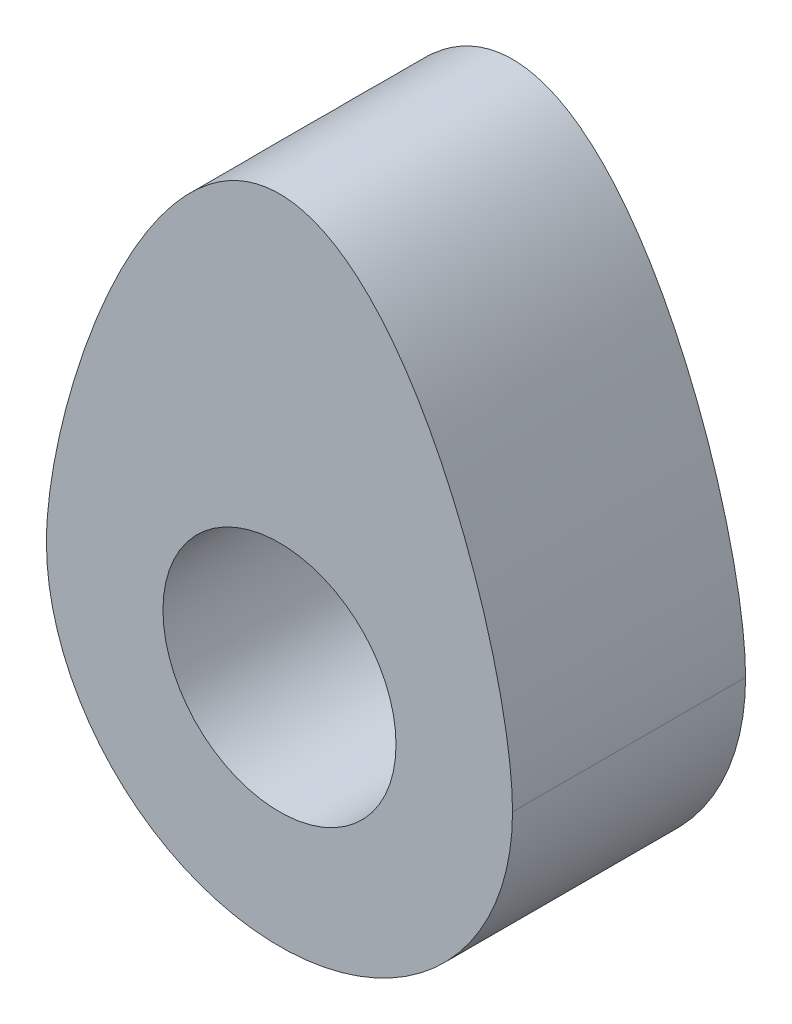
ISO-10303-21;
HEADER;
FILE_DESCRIPTION(('STEP AP214'),'2;1');
FILE_NAME('part.step','',(''),(''),'','','');
FILE_SCHEMA(('AUTOMOTIVE_DESIGN { 1 0 10303 214 1 1 1 1 }'));
ENDSEC;
DATA;
#1=APPLICATION_CONTEXT('core data for automotive mechanical design processes');
#2=APPLICATION_PROTOCOL_DEFINITION('international standard','automotive_design',2000,#1);
#3=PRODUCT_CONTEXT('',#1,'mechanical');
#4=PRODUCT('Part','Part','',(#3));
#5=PRODUCT_RELATED_PRODUCT_CATEGORY('part','',(#4));
#6=PRODUCT_DEFINITION_FORMATION('','',#4);
#7=PRODUCT_DEFINITION_CONTEXT('part definition',#1,'design');
#8=PRODUCT_DEFINITION('design','',#6,#7);
#9=PRODUCT_DEFINITION_SHAPE('','',#8);
#10=(LENGTH_UNIT() NAMED_UNIT(*) SI_UNIT(.MILLI.,.METRE.));
#11=(NAMED_UNIT(*) PLANE_ANGLE_UNIT() SI_UNIT($,.RADIAN.));
#12=(NAMED_UNIT(*) SI_UNIT($,.STERADIAN.) SOLID_ANGLE_UNIT());
#13=UNCERTAINTY_MEASURE_WITH_UNIT(LENGTH_MEASURE(1.E-05),#10,'distance_accuracy_value','');
#14=(GEOMETRIC_REPRESENTATION_CONTEXT(3) GLOBAL_UNCERTAINTY_ASSIGNED_CONTEXT((#13)) GLOBAL_UNIT_ASSIGNED_CONTEXT((#10,
#11,#12)) REPRESENTATION_CONTEXT('',''));
#15=CARTESIAN_POINT('',(0.,0.,0.));
#16=DIRECTION('',(0.,0.,1.));
#17=DIRECTION('',(1.,0.,0.));
#18=AXIS2_PLACEMENT_3D('',#15,#16,#17);
#19=CARTESIAN_POINT('',(0.,22.8203125,6.35));
#20=DIRECTION('',(0.,0.,1.));
#21=DIRECTION('',(1.,0.,0.));
#22=AXIS2_PLACEMENT_3D('',#19,#20,#21);
#23=PLANE('',#22);
#24=CARTESIAN_POINT('',(12.7,0.,6.35));
#25=CARTESIAN_POINT('',(12.7,9.525,6.35));
#26=CARTESIAN_POINT('',(4.1275,31.75,6.35));
#27=CARTESIAN_POINT('',(-4.1275,31.75,6.35));
#28=CARTESIAN_POINT('',(-12.7,9.525,6.35));
#29=CARTESIAN_POINT('',(-12.7,0.,6.35));
#30=B_SPLINE_CURVE_WITH_KNOTS('',5,(#24,#25,#26,#27,#28,#29),.UNSPECIFIED.,.F.,.F.,(6,6),(0.,
1.),.UNSPECIFIED.);
#31=CARTESIAN_POINT('',(12.7,0.,6.35));
#32=VERTEX_POINT('',#31);
#33=CARTESIAN_POINT('',(-12.7,0.,6.35));
#34=VERTEX_POINT('',#33);
#35=EDGE_CURVE('E65',#32,#34,#30,.T.);
#36=ORIENTED_EDGE('',*,*,#35,.T.);
#37=CARTESIAN_POINT('',(0.,0.,6.35));
#38=DIRECTION('',(0.,0.,1.));
#39=DIRECTION('',(1.,0.,0.));
#40=AXIS2_PLACEMENT_3D('',#37,#38,#39);
#41=CIRCLE('',#40,12.7);
#42=EDGE_CURVE('E50',#34,#32,#41,.T.);
#43=ORIENTED_EDGE('',*,*,#42,.T.);
#44=EDGE_LOOP('',(#36,#43));
#45=FACE_BOUND('',#44,.T.);
#46=CARTESIAN_POINT('',(0.,0.,6.35));
#47=DIRECTION('',(0.,0.,1.));
#48=DIRECTION('',(1.,0.,0.));
#49=AXIS2_PLACEMENT_3D('',#46,#47,#48);
#50=CIRCLE('',#49,6.35);
#51=CARTESIAN_POINT('',(6.35,0.,6.35));
#52=VERTEX_POINT('',#51);
#53=EDGE_CURVE('E71',#52,#52,#50,.T.);
#54=ORIENTED_EDGE('',*,*,#53,.F.);
#55=EDGE_LOOP('',(#54));
#56=FACE_BOUND('',#55,.T.);
#57=ADVANCED_FACE('F33',(#45,#56),#23,.T.);
#58=CARTESIAN_POINT('',(0.,22.8203125,-6.35));
#59=DIRECTION('',(0.,0.,1.));
#60=DIRECTION('',(1.,0.,0.));
#61=AXIS2_PLACEMENT_3D('',#58,#59,#60);
#62=PLANE('',#61);
#63=CARTESIAN_POINT('',(12.7,0.,-6.35));
#64=CARTESIAN_POINT('',(12.7,9.525,-6.35));
#65=CARTESIAN_POINT('',(4.1275,31.75,-6.35));
#66=CARTESIAN_POINT('',(-4.1275,31.75,-6.35));
#67=CARTESIAN_POINT('',(-12.7,9.525,-6.35));
#68=CARTESIAN_POINT('',(-12.7,0.,-6.35));
#69=B_SPLINE_CURVE_WITH_KNOTS('',5,(#63,#64,#65,#66,#67,#68),.UNSPECIFIED.,.F.,.F.,(6,6),(0.,
1.),.UNSPECIFIED.);
#70=CARTESIAN_POINT('',(12.7,0.,-6.35));
#71=VERTEX_POINT('',#70);
#72=CARTESIAN_POINT('',(-12.7,0.,-6.35));
#73=VERTEX_POINT('',#72);
#74=EDGE_CURVE('E66',#71,#73,#69,.T.);
#75=ORIENTED_EDGE('',*,*,#74,.F.);
#76=CARTESIAN_POINT('',(0.,0.,-6.35));
#77=DIRECTION('',(0.,0.,1.));
#78=DIRECTION('',(1.,0.,0.));
#79=AXIS2_PLACEMENT_3D('',#76,#77,#78);
#80=CIRCLE('',#79,12.7);
#81=EDGE_CURVE('E58',#73,#71,#80,.T.);
#82=ORIENTED_EDGE('',*,*,#81,.F.);
#83=EDGE_LOOP('',(#75,#82));
#84=FACE_BOUND('',#83,.T.);
#85=CARTESIAN_POINT('',(0.,0.,-6.35));
#86=DIRECTION('',(0.,0.,1.));
#87=DIRECTION('',(1.,0.,0.));
#88=AXIS2_PLACEMENT_3D('',#85,#86,#87);
#89=CIRCLE('',#88,6.35);
#90=CARTESIAN_POINT('',(6.35,0.,-6.35));
#91=VERTEX_POINT('',#90);
#92=EDGE_CURVE('E74',#91,#91,#89,.T.);
#93=ORIENTED_EDGE('',*,*,#92,.T.);
#94=EDGE_LOOP('',(#93));
#95=FACE_BOUND('',#94,.T.);
#96=ADVANCED_FACE('F69',(#84,#95),#62,.F.);
#97=DIRECTION('',(0.,0.,-1.));
#98=VECTOR('',#97,1.);
#99=SURFACE_OF_LINEAR_EXTRUSION('',#30,#98);
#100=ORIENTED_EDGE('',*,*,#74,.T.);
#101=DIRECTION('',(0.,0.,-1.));
#102=VECTOR('',#101,1.);
#103=CARTESIAN_POINT('',(-12.7,0.,6.35));
#104=LINE('',#103,#102);
#105=EDGE_CURVE('E11',#34,#73,#104,.T.);
#106=ORIENTED_EDGE('',*,*,#105,.F.);
#107=ORIENTED_EDGE('',*,*,#35,.F.);
#108=DIRECTION('',(0.,0.,-1.));
#109=VECTOR('',#108,1.);
#110=CARTESIAN_POINT('',(12.7,0.,6.35));
#111=LINE('',#110,#109);
#112=EDGE_CURVE('E43',#32,#71,#111,.T.);
#113=ORIENTED_EDGE('',*,*,#112,.T.);
#114=EDGE_LOOP('',(#100,#106,#107,#113));
#115=FACE_BOUND('',#114,.T.);
#116=ADVANCED_FACE('F35',(#115),#99,.F.);
#117=CARTESIAN_POINT('',(0.,0.,6.35));
#118=DIRECTION('',(0.,0.,-1.));
#119=DIRECTION('',(-1.,0.,0.));
#120=AXIS2_PLACEMENT_3D('',#117,#118,#119);
#121=CYLINDRICAL_SURFACE('',#120,12.7);
#122=ORIENTED_EDGE('',*,*,#81,.T.);
#123=ORIENTED_EDGE('',*,*,#112,.F.);
#124=ORIENTED_EDGE('',*,*,#42,.F.);
#125=ORIENTED_EDGE('',*,*,#105,.T.);
#126=EDGE_LOOP('',(#122,#123,#124,#125));
#127=FACE_BOUND('',#126,.T.);
#128=ADVANCED_FACE('F61',(#127),#121,.T.);
#129=CARTESIAN_POINT('',(0.,0.,6.35));
#130=DIRECTION('',(0.,0.,-1.));
#131=DIRECTION('',(-1.,0.,0.));
#132=AXIS2_PLACEMENT_3D('',#129,#130,#131);
#133=CYLINDRICAL_SURFACE('',#132,6.35);
#134=ORIENTED_EDGE('',*,*,#53,.T.);
#135=EDGE_LOOP('',(#134));
#136=FACE_BOUND('',#135,.T.);
#137=ORIENTED_EDGE('',*,*,#92,.F.);
#138=EDGE_LOOP('',(#137));
#139=FACE_BOUND('',#138,.T.);
#140=ADVANCED_FACE('F92',(#136,#139),#133,.F.);
#141=CLOSED_SHELL('',(#57,#96,#116,#128,#140));
#142=MANIFOLD_SOLID_BREP('B2',#141);
#143=ADVANCED_BREP_SHAPE_REPRESENTATION('',(#18,#142),#14);
#144=SHAPE_DEFINITION_REPRESENTATION(#9,#143);
ENDSEC;
END-ISO-10303-21;
